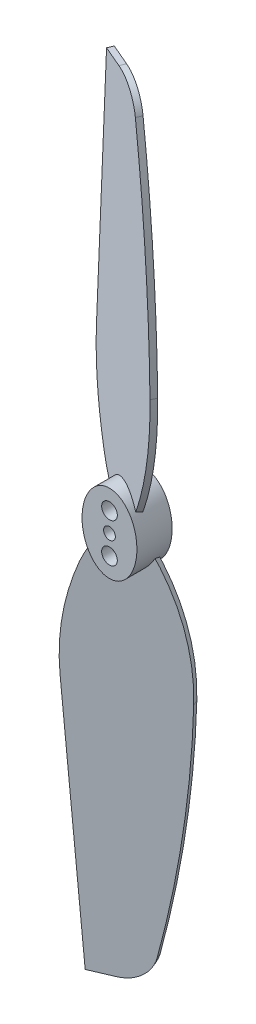
ISO-10303-21;
HEADER;
FILE_DESCRIPTION(('STEP AP214'),'2;1');
FILE_NAME('part.step','',(''),(''),'','','');
FILE_SCHEMA(('AUTOMOTIVE_DESIGN { 1 0 10303 214 1 1 1 1 }'));
ENDSEC;
DATA;
#1=APPLICATION_CONTEXT('core data for automotive mechanical design processes');
#2=APPLICATION_PROTOCOL_DEFINITION('international standard','automotive_design',2000,#1);
#3=PRODUCT_CONTEXT('',#1,'mechanical');
#4=PRODUCT('Part','Part','',(#3));
#5=PRODUCT_RELATED_PRODUCT_CATEGORY('part','',(#4));
#6=PRODUCT_DEFINITION_FORMATION('','',#4);
#7=PRODUCT_DEFINITION_CONTEXT('part definition',#1,'design');
#8=PRODUCT_DEFINITION('design','',#6,#7);
#9=PRODUCT_DEFINITION_SHAPE('','',#8);
#10=(LENGTH_UNIT() NAMED_UNIT(*) SI_UNIT(.MILLI.,.METRE.));
#11=(NAMED_UNIT(*) PLANE_ANGLE_UNIT() SI_UNIT($,.RADIAN.));
#12=(NAMED_UNIT(*) SI_UNIT($,.STERADIAN.) SOLID_ANGLE_UNIT());
#13=UNCERTAINTY_MEASURE_WITH_UNIT(LENGTH_MEASURE(1.E-05),#10,'distance_accuracy_value','');
#14=(GEOMETRIC_REPRESENTATION_CONTEXT(3) GLOBAL_UNCERTAINTY_ASSIGNED_CONTEXT((#13)) GLOBAL_UNIT_ASSIGNED_CONTEXT((#10,
#11,#12)) REPRESENTATION_CONTEXT('',''));
#15=CARTESIAN_POINT('',(0.,0.,0.));
#16=DIRECTION('',(0.,0.,1.));
#17=DIRECTION('',(1.,0.,0.));
#18=AXIS2_PLACEMENT_3D('',#15,#16,#17);
#19=CARTESIAN_POINT('',(0.,0.,4.5));
#20=DIRECTION('',(0.,0.,1.));
#21=DIRECTION('',(0.,1.,0.));
#22=AXIS2_PLACEMENT_3D('',#19,#20,#21);
#23=ELLIPSE('',#22,5.,3.5);
#24=DIRECTION('',(0.,0.,-1.));
#25=VECTOR('',#24,1.);
#26=SURFACE_OF_LINEAR_EXTRUSION('',#23,#25);
#27=CARTESIAN_POINT('',(0.,0.,0.));
#28=DIRECTION('',(0.,0.,1.));
#29=DIRECTION('',(0.,1.,0.));
#30=AXIS2_PLACEMENT_3D('',#27,#28,#29);
#31=ELLIPSE('',#30,5.,3.5);
#32=CARTESIAN_POINT('',(0.,5.,0.));
#33=VERTEX_POINT('',#32);
#34=EDGE_CURVE('E62',#33,#33,#31,.T.);
#35=ORIENTED_EDGE('',*,*,#34,.T.);
#36=EDGE_LOOP('',(#35));
#37=FACE_BOUND('',#36,.T.);
#38=CARTESIAN_POINT('',(0.,5.,4.5));
#39=VERTEX_POINT('',#38);
#40=EDGE_CURVE('E11',#39,#39,#23,.T.);
#41=ORIENTED_EDGE('',*,*,#40,.F.);
#42=EDGE_LOOP('',(#41));
#43=FACE_BOUND('',#42,.T.);
#44=ADVANCED_FACE('F54',(#37,#43),#26,.F.);
#45=CARTESIAN_POINT('',(0.,0.,4.5));
#46=DIRECTION('',(0.,0.,1.));
#47=DIRECTION('',(1.,0.,0.));
#48=AXIS2_PLACEMENT_3D('',#45,#46,#47);
#49=PLANE('',#48);
#50=CARTESIAN_POINT('',(0.,0.,4.5));
#51=DIRECTION('',(0.,0.,1.));
#52=DIRECTION('',(1.,0.,0.));
#53=AXIS2_PLACEMENT_3D('',#50,#51,#52);
#54=CIRCLE('',#53,0.75);
#55=CARTESIAN_POINT('',(0.75,0.,4.5));
#56=VERTEX_POINT('',#55);
#57=EDGE_CURVE('E75',#56,#56,#54,.T.);
#58=ORIENTED_EDGE('',*,*,#57,.F.);
#59=EDGE_LOOP('',(#58));
#60=FACE_BOUND('',#59,.T.);
#61=CARTESIAN_POINT('',(0.,2.5,4.5));
#62=DIRECTION('',(0.,0.,1.));
#63=DIRECTION('',(1.,0.,0.));
#64=AXIS2_PLACEMENT_3D('',#61,#62,#63);
#65=CIRCLE('',#64,1.);
#66=CARTESIAN_POINT('',(1.,2.5,4.5));
#67=VERTEX_POINT('',#66);
#68=EDGE_CURVE('E121',#67,#67,#65,.T.);
#69=ORIENTED_EDGE('',*,*,#68,.F.);
#70=EDGE_LOOP('',(#69));
#71=FACE_BOUND('',#70,.T.);
#72=CARTESIAN_POINT('',(0.,-2.5,4.5));
#73=DIRECTION('',(0.,0.,1.));
#74=DIRECTION('',(1.,0.,0.));
#75=AXIS2_PLACEMENT_3D('',#72,#73,#74);
#76=CIRCLE('',#75,1.);
#77=CARTESIAN_POINT('',(1.,-2.5,4.5));
#78=VERTEX_POINT('',#77);
#79=EDGE_CURVE('E69',#78,#78,#76,.T.);
#80=ORIENTED_EDGE('',*,*,#79,.F.);
#81=EDGE_LOOP('',(#80));
#82=FACE_BOUND('',#81,.T.);
#83=ORIENTED_EDGE('',*,*,#40,.T.);
#84=EDGE_LOOP('',(#83));
#85=FACE_BOUND('',#84,.T.);
#86=ADVANCED_FACE('F97',(#60,#71,#82,#85),#49,.T.);
#87=CARTESIAN_POINT('',(0.,0.,0.));
#88=DIRECTION('',(0.,0.,1.));
#89=DIRECTION('',(1.,0.,0.));
#90=AXIS2_PLACEMENT_3D('',#87,#88,#89);
#91=PLANE('',#90);
#92=CARTESIAN_POINT('',(0.,0.,0.));
#93=DIRECTION('',(0.,0.,1.));
#94=DIRECTION('',(1.,0.,0.));
#95=AXIS2_PLACEMENT_3D('',#92,#93,#94);
#96=CIRCLE('',#95,0.75);
#97=CARTESIAN_POINT('',(0.75,0.,0.));
#98=VERTEX_POINT('',#97);
#99=EDGE_CURVE('E58',#98,#98,#96,.T.);
#100=ORIENTED_EDGE('',*,*,#99,.T.);
#101=EDGE_LOOP('',(#100));
#102=FACE_BOUND('',#101,.T.);
#103=CARTESIAN_POINT('',(0.,2.5,0.));
#104=DIRECTION('',(0.,0.,1.));
#105=DIRECTION('',(1.,0.,0.));
#106=AXIS2_PLACEMENT_3D('',#103,#104,#105);
#107=CIRCLE('',#106,1.);
#108=CARTESIAN_POINT('',(1.,2.5,0.));
#109=VERTEX_POINT('',#108);
#110=EDGE_CURVE('E74',#109,#109,#107,.T.);
#111=ORIENTED_EDGE('',*,*,#110,.T.);
#112=EDGE_LOOP('',(#111));
#113=FACE_BOUND('',#112,.T.);
#114=CARTESIAN_POINT('',(0.,-2.5,0.));
#115=DIRECTION('',(0.,0.,1.));
#116=DIRECTION('',(1.,0.,0.));
#117=AXIS2_PLACEMENT_3D('',#114,#115,#116);
#118=CIRCLE('',#117,1.);
#119=CARTESIAN_POINT('',(1.,-2.5,0.));
#120=VERTEX_POINT('',#119);
#121=EDGE_CURVE('E72',#120,#120,#118,.T.);
#122=ORIENTED_EDGE('',*,*,#121,.T.);
#123=EDGE_LOOP('',(#122));
#124=FACE_BOUND('',#123,.T.);
#125=ORIENTED_EDGE('',*,*,#34,.F.);
#126=EDGE_LOOP('',(#125));
#127=FACE_BOUND('',#126,.T.);
#128=ADVANCED_FACE('F82',(#102,#113,#124,#127),#91,.F.);
#129=CARTESIAN_POINT('',(0.,-2.5,-0.689462870256029));
#130=DIRECTION('',(0.,0.,1.));
#131=DIRECTION('',(1.,0.,0.));
#132=AXIS2_PLACEMENT_3D('',#129,#130,#131);
#133=CYLINDRICAL_SURFACE('',#132,1.);
#134=ORIENTED_EDGE('',*,*,#79,.T.);
#135=EDGE_LOOP('',(#134));
#136=FACE_BOUND('',#135,.T.);
#137=ORIENTED_EDGE('',*,*,#121,.F.);
#138=EDGE_LOOP('',(#137));
#139=FACE_BOUND('',#138,.T.);
#140=ADVANCED_FACE('F92',(#136,#139),#133,.F.);
#141=CARTESIAN_POINT('',(0.,2.5,-0.689462870256029));
#142=DIRECTION('',(0.,0.,1.));
#143=DIRECTION('',(1.,0.,0.));
#144=AXIS2_PLACEMENT_3D('',#141,#142,#143);
#145=CYLINDRICAL_SURFACE('',#144,1.);
#146=ORIENTED_EDGE('',*,*,#68,.T.);
#147=EDGE_LOOP('',(#146));
#148=FACE_BOUND('',#147,.T.);
#149=ORIENTED_EDGE('',*,*,#110,.F.);
#150=EDGE_LOOP('',(#149));
#151=FACE_BOUND('',#150,.T.);
#152=ADVANCED_FACE('F86',(#148,#151),#145,.F.);
#153=CARTESIAN_POINT('',(0.,0.,-0.689462870256029));
#154=DIRECTION('',(0.,0.,1.));
#155=DIRECTION('',(1.,0.,0.));
#156=AXIS2_PLACEMENT_3D('',#153,#154,#155);
#157=CYLINDRICAL_SURFACE('',#156,0.75);
#158=ORIENTED_EDGE('',*,*,#57,.T.);
#159=EDGE_LOOP('',(#158));
#160=FACE_BOUND('',#159,.T.);
#161=ORIENTED_EDGE('',*,*,#99,.F.);
#162=EDGE_LOOP('',(#161));
#163=FACE_BOUND('',#162,.T.);
#164=ADVANCED_FACE('F84',(#160,#163),#157,.F.);
#165=CLOSED_SHELL('',(#44,#86,#128,#140,#152,#164));
#166=MANIFOLD_SOLID_BREP('B2',#165);
#167=CARTESIAN_POINT('',(1.3145287411941,0.,2.27814653766199));
#168=DIRECTION('',(0.,1.,0.));
#169=DIRECTION('',(-0.724137930705924,0.,-0.68965517275878));
#170=AXIS2_PLACEMENT_3D('',#167,#168,#169);
#171=PLANE('',#170);
#172=DIRECTION('',(0.,0.,1.));
#173=VECTOR('',#172,1.);
#174=CARTESIAN_POINT('',(-0.75,0.,-0.689462870256029));
#175=LINE('',#174,#173);
#176=CARTESIAN_POINT('',(-0.749999999999999,0.,2.34696887869071));
#177=VERTEX_POINT('',#176);
#178=CARTESIAN_POINT('',(-0.75,0.,2.53809487809043));
#179=VERTEX_POINT('',#178);
#180=EDGE_CURVE('E327',#177,#179,#175,.T.);
#181=ORIENTED_EDGE('',*,*,#180,.F.);
#182=DIRECTION('',(-0.919145030205725,0.,0.393919298141278));
#183=VECTOR('',#182,1.);
#184=CARTESIAN_POINT('',(1.01908926758814,0.,1.5887877650077));
#185=LINE('',#184,#183);
#186=CARTESIAN_POINT('',(-0.819200792823308,0.,2.37662636129025));
#187=VERTEX_POINT('',#186);
#188=EDGE_CURVE('E301',#177,#187,#185,.T.);
#189=ORIENTED_EDGE('',*,*,#188,.T.);
#190=DIRECTION('',(-0.393919298141278,0.,-0.919145030205725));
#191=VECTOR('',#190,1.);
#192=CARTESIAN_POINT('',(-0.52376131921735,0.,3.06598513394455));
#193=LINE('',#192,#191);
#194=EDGE_CURVE('E308',#179,#187,#193,.T.);
#195=ORIENTED_EDGE('',*,*,#194,.F.);
#196=EDGE_LOOP('',(#181,#189,#195));
#197=FACE_BOUND('',#196,.T.);
#198=ADVANCED_FACE('F177',(#197),#171,.T.);
#199=CARTESIAN_POINT('',(21.9152398199257,-15.7156926478818,-6.55072962732023));
#200=DIRECTION('',(-0.393919298141278,0.,-0.919145030205725));
#201=DIRECTION('',(-0.919145030205725,0.,0.393919298141278));
#202=AXIS2_PLACEMENT_3D('',#199,#200,#201);
#203=CYLINDRICAL_SURFACE('',#202,30.);
#204=CARTESIAN_POINT('',(21.6198003463197,-15.7156926478818,-7.24008839997453));
#205=DIRECTION('',(0.393919298141278,0.,0.919145030205725));
#206=DIRECTION('',(-0.919145030205725,0.,0.393919298141278));
#207=AXIS2_PLACEMENT_3D('',#204,#205,#206);
#208=CIRCLE('',#207,30.);
#209=CARTESIAN_POINT('',(-4.13552137977223,-5.,3.79790661096967));
#210=VERTEX_POINT('',#209);
#211=CARTESIAN_POINT('',(-5.8744984589548,-18.,4.54318250106728));
#212=VERTEX_POINT('',#211);
#213=EDGE_CURVE('E287',#210,#212,#208,.T.);
#214=ORIENTED_EDGE('',*,*,#213,.T.);
#215=DIRECTION('',(-0.393919298141278,0.,-0.919145030205725));
#216=VECTOR('',#215,1.);
#217=CARTESIAN_POINT('',(-5.57905898534884,-18.,5.23254127372158));
#218=LINE('',#217,#216);
#219=CARTESIAN_POINT('',(-5.57905898534884,-18.,5.23254127372158));
#220=VERTEX_POINT('',#219);
#221=EDGE_CURVE('E286',#220,#212,#218,.T.);
#222=ORIENTED_EDGE('',*,*,#221,.F.);
#223=CARTESIAN_POINT('',(21.9152398199257,-15.7156926478818,-6.55072962732023));
#224=DIRECTION('',(0.393919298141278,0.,0.919145030205725));
#225=DIRECTION('',(-0.919145030205725,0.,0.393919298141278));
#226=AXIS2_PLACEMENT_3D('',#223,#224,#225);
#227=CIRCLE('',#226,30.);
#228=CARTESIAN_POINT('',(-3.84008190616627,-5.,4.48726538362396));
#229=VERTEX_POINT('',#228);
#230=EDGE_CURVE('E306',#229,#220,#227,.T.);
#231=ORIENTED_EDGE('',*,*,#230,.F.);
#232=DIRECTION('',(-0.393919298141278,0.,-0.919145030205725));
#233=VECTOR('',#232,1.);
#234=CARTESIAN_POINT('',(-3.84008190616627,-5.,4.48726538362396));
#235=LINE('',#234,#233);
#236=EDGE_CURVE('E185',#229,#210,#235,.T.);
#237=ORIENTED_EDGE('',*,*,#236,.T.);
#238=EDGE_LOOP('',(#214,#222,#231,#237));
#239=FACE_BOUND('',#238,.T.);
#240=ADVANCED_FACE('F179',(#239),#203,.T.);
#241=CARTESIAN_POINT('',(6.46204678427051,-9.28627705915271,0.0720673792462853));
#242=DIRECTION('',(-0.393919298141278,0.,-0.919145030205725));
#243=DIRECTION('',(-0.919145030205725,0.,0.393919298141278));
#244=AXIS2_PLACEMENT_3D('',#241,#242,#243);
#245=CYLINDRICAL_SURFACE('',#244,12.);
#246=CARTESIAN_POINT('',(-0.75,0.,2.53809487809043));
#247=CARTESIAN_POINT('',(-0.749996468598497,-0.0164378048235438,2.58908687690633));
#248=CARTESIAN_POINT('',(-0.749459645822779,-0.0326092065875987,2.64016267214185));
#249=CARTESIAN_POINT('',(-0.747397567067205,-0.0644396910591233,2.74243276950829));
#250=CARTESIAN_POINT('',(-0.745872686743596,-0.0800989660995931,2.79362701923538));
#251=CARTESIAN_POINT('',(-0.741912546858403,-0.110937937879825,2.89612307861109));
#252=CARTESIAN_POINT('',(-0.739477298974362,-0.126117640768485,2.94742488687164));
#253=CARTESIAN_POINT('',(-0.733750101990573,-0.15601889722111,3.05013551591533));
#254=CARTESIAN_POINT('',(-0.730457827728856,-0.170740274514427,3.10154436995264));
#255=CARTESIAN_POINT('',(-0.726764836807171,-0.185237339596115,3.15298664136786));
#256=B_SPLINE_CURVE_WITH_KNOTS('',3,(#246,#247,#248,#249,#250,#251,#252,#253,#254,#255),
.UNSPECIFIED.,.F.,.F.,(4,2,2,2,4),(0.,0.160721728299978,0.321382386550923,0.482040984032935,
0.642760625609639),.UNSPECIFIED.);
#257=CARTESIAN_POINT('',(-0.726764836806105,-0.185237339595355,3.15298664136811));
#258=VERTEX_POINT('',#257);
#259=EDGE_CURVE('E332',#179,#258,#256,.T.);
#260=ORIENTED_EDGE('',*,*,#259,.F.);
#261=ORIENTED_EDGE('',*,*,#194,.T.);
#262=CARTESIAN_POINT('',(6.16660731066455,-9.28627705915271,-0.61729139340801));
#263=DIRECTION('',(0.393919298141278,0.,0.919145030205725));
#264=DIRECTION('',(-0.919145030205725,0.,0.393919298141278));
#265=AXIS2_PLACEMENT_3D('',#262,#263,#264);
#266=CIRCLE('',#265,12.);
#267=EDGE_CURVE('E233',#187,#210,#266,.T.);
#268=ORIENTED_EDGE('',*,*,#267,.T.);
#269=ORIENTED_EDGE('',*,*,#236,.F.);
#270=CARTESIAN_POINT('',(6.46204678427051,-9.28627705915271,0.0720673792462853));
#271=DIRECTION('',(0.393919298141278,0.,0.919145030205725));
#272=DIRECTION('',(-0.919145030205725,0.,0.393919298141278));
#273=AXIS2_PLACEMENT_3D('',#270,#271,#272);
#274=CIRCLE('',#273,12.);
#275=EDGE_CURVE('E200',#258,#229,#274,.T.);
#276=ORIENTED_EDGE('',*,*,#275,.F.);
#277=EDGE_LOOP('',(#260,#261,#268,#269,#276));
#278=FACE_BOUND('',#277,.T.);
#279=ADVANCED_FACE('F342',(#278),#245,.T.);
#280=DIRECTION('',(0.,0.,1.));
#281=VECTOR('',#280,1.);
#282=CARTESIAN_POINT('',(0.75,0.,-0.689462870256029));
#283=LINE('',#282,#281);
#284=CARTESIAN_POINT('',(0.75,0.,2.52008742642683));
#285=VERTEX_POINT('',#284);
#286=CARTESIAN_POINT('',(0.750000000000001,0.,1.70411173667944));
#287=VERTEX_POINT('',#286);
#288=EDGE_CURVE('E191',#285,#287,#283,.F.);
#289=ORIENTED_EDGE('',*,*,#288,.F.);
#290=DIRECTION('',(-0.919145030205725,0.,0.393919298141278));
#291=VECTOR('',#290,1.);
#292=CARTESIAN_POINT('',(1.3145287411941,0.,2.27814653766199));
#293=LINE('',#292,#291);
#294=CARTESIAN_POINT('',(1.31452874119409,0.,2.278146537662));
#295=VERTEX_POINT('',#294);
#296=EDGE_CURVE('E280',#295,#285,#293,.T.);
#297=ORIENTED_EDGE('',*,*,#296,.F.);
#298=DIRECTION('',(-0.393919298141278,0.,-0.919145030205725));
#299=VECTOR('',#298,1.);
#300=CARTESIAN_POINT('',(1.31452874119409,0.,2.278146537662));
#301=LINE('',#300,#299);
#302=CARTESIAN_POINT('',(1.01908926758813,0.,1.5887877650077));
#303=VERTEX_POINT('',#302);
#304=EDGE_CURVE('E274',#295,#303,#301,.T.);
#305=ORIENTED_EDGE('',*,*,#304,.T.);
#306=EDGE_CURVE('E302',#303,#287,#185,.T.);
#307=ORIENTED_EDGE('',*,*,#306,.T.);
#308=EDGE_LOOP('',(#289,#297,#305,#307));
#309=FACE_BOUND('',#308,.T.);
#310=ADVANCED_FACE('F363',(#309),#171,.T.);
#311=CARTESIAN_POINT('',(-21.197524437125,-17.3240618265888,11.9261693156753));
#312=DIRECTION('',(-0.393919298141278,0.,-0.919145030205725));
#313=DIRECTION('',(-0.919145030205725,0.,0.393919298141278));
#314=AXIS2_PLACEMENT_3D('',#311,#312,#313);
#315=CYLINDRICAL_SURFACE('',#314,30.);
#316=CARTESIAN_POINT('',(-21.4929639107309,-17.3240618265888,11.236810543021));
#317=DIRECTION('',(-0.393919298141278,0.,-0.919145030205725));
#318=DIRECTION('',(0.919145030205725,0.,-0.393919298141278));
#319=AXIS2_PLACEMENT_3D('',#316,#317,#318);
#320=CIRCLE('',#319,30.);
#321=CARTESIAN_POINT('',(6.07438693371967,-18.,-0.577768374769338));
#322=VERTEX_POINT('',#321);
#323=EDGE_CURVE('E299',#303,#322,#320,.T.);
#324=ORIENTED_EDGE('',*,*,#323,.F.);
#325=ORIENTED_EDGE('',*,*,#304,.F.);
#326=CARTESIAN_POINT('',(-21.197524437125,-17.3240618265888,11.9261693156753));
#327=DIRECTION('',(-0.393919298141278,0.,-0.919145030205725));
#328=DIRECTION('',(0.919145030205725,0.,-0.393919298141278));
#329=AXIS2_PLACEMENT_3D('',#326,#327,#328);
#330=CIRCLE('',#329,30.);
#331=CARTESIAN_POINT('',(6.36982640732562,-18.,0.111590397884956));
#332=VERTEX_POINT('',#331);
#333=EDGE_CURVE('E259',#295,#332,#330,.T.);
#334=ORIENTED_EDGE('',*,*,#333,.T.);
#335=DIRECTION('',(-0.393919298141278,0.,-0.919145030205725));
#336=VECTOR('',#335,1.);
#337=CARTESIAN_POINT('',(6.36982640732562,-18.,0.111590397884956));
#338=LINE('',#337,#336);
#339=EDGE_CURVE('E268',#332,#322,#338,.T.);
#340=ORIENTED_EDGE('',*,*,#339,.T.);
#341=EDGE_LOOP('',(#324,#325,#334,#340));
#342=FACE_BOUND('',#341,.T.);
#343=ADVANCED_FACE('F277',(#342),#315,.T.);
#344=CARTESIAN_POINT('',(-127.576836429602,-14.715692301252,57.5173029667481));
#345=DIRECTION('',(-0.393919298141278,0.,-0.919145030205725));
#346=DIRECTION('',(-0.919145030205725,0.,0.393919298141278));
#347=AXIS2_PLACEMENT_3D('',#344,#345,#346);
#348=CYLINDRICAL_SURFACE('',#347,145.766631976418);
#349=CARTESIAN_POINT('',(-127.872275903208,-14.715692301252,56.8279441940938));
#350=DIRECTION('',(-0.393919298141278,0.,-0.919145030205725));
#351=DIRECTION('',(0.919145030205725,0.,-0.393919298141278));
#352=AXIS2_PLACEMENT_3D('',#349,#350,#351);
#353=CIRCLE('',#352,145.766631976418);
#354=CARTESIAN_POINT('',(2.80562123359325,-46.8818098813125,0.823131209155812));
#355=VERTEX_POINT('',#354);
#356=EDGE_CURVE('E271',#322,#355,#353,.T.);
#357=ORIENTED_EDGE('',*,*,#356,.F.);
#358=ORIENTED_EDGE('',*,*,#339,.F.);
#359=CARTESIAN_POINT('',(-127.576836429602,-14.715692301252,57.5173029667481));
#360=DIRECTION('',(-0.393919298141278,0.,-0.919145030205725));
#361=DIRECTION('',(0.919145030205725,0.,-0.393919298141278));
#362=AXIS2_PLACEMENT_3D('',#359,#360,#361);
#363=CIRCLE('',#362,145.766631976418);
#364=CARTESIAN_POINT('',(3.10106070719921,-46.8818098813125,1.51248998181011));
#365=VERTEX_POINT('',#364);
#366=EDGE_CURVE('E254',#332,#365,#363,.T.);
#367=ORIENTED_EDGE('',*,*,#366,.T.);
#368=DIRECTION('',(-0.393919298141278,0.,-0.919145030205725));
#369=VECTOR('',#368,1.);
#370=CARTESIAN_POINT('',(3.10106070719921,-46.8818098813125,1.51248998181011));
#371=LINE('',#370,#369);
#372=EDGE_CURVE('E275',#365,#355,#371,.T.);
#373=ORIENTED_EDGE('',*,*,#372,.T.);
#374=EDGE_LOOP('',(#357,#358,#367,#373));
#375=FACE_BOUND('',#374,.T.);
#376=ADVANCED_FACE('F269',(#375),#348,.T.);
#377=CARTESIAN_POINT('',(-0.487208620676712,-45.9985641631131,3.05031969173346));
#378=DIRECTION('',(-0.393919298141278,0.,-0.919145030205725));
#379=DIRECTION('',(-0.919145030205725,0.,0.393919298141278));
#380=AXIS2_PLACEMENT_3D('',#377,#378,#379);
#381=CYLINDRICAL_SURFACE('',#380,4.00258916013318);
#382=CARTESIAN_POINT('',(-0.78264809428267,-45.9985641631131,2.36096091907916));
#383=DIRECTION('',(0.393919298141278,0.,0.919145030205725));
#384=DIRECTION('',(-0.919145030205725,0.,0.393919298141278));
#385=AXIS2_PLACEMENT_3D('',#382,#383,#384);
#386=CIRCLE('',#385,4.00258916013318);
#387=CARTESIAN_POINT('',(-0.870958887229646,-50.,2.39880840172092));
#388=VERTEX_POINT('',#387);
#389=EDGE_CURVE('E296',#388,#355,#386,.T.);
#390=ORIENTED_EDGE('',*,*,#389,.T.);
#391=ORIENTED_EDGE('',*,*,#372,.F.);
#392=CARTESIAN_POINT('',(-0.487208620676712,-45.9985641631131,3.05031969173346));
#393=DIRECTION('',(0.393919298141278,0.,0.919145030205725));
#394=DIRECTION('',(-0.919145030205725,0.,0.393919298141278));
#395=AXIS2_PLACEMENT_3D('',#392,#393,#394);
#396=CIRCLE('',#395,4.00258916013318);
#397=CARTESIAN_POINT('',(-0.575519413623688,-50.,3.08816717437522));
#398=VERTEX_POINT('',#397);
#399=EDGE_CURVE('E262',#398,#365,#396,.T.);
#400=ORIENTED_EDGE('',*,*,#399,.F.);
#401=DIRECTION('',(-0.393919298141278,0.,-0.919145030205725));
#402=VECTOR('',#401,1.);
#403=CARTESIAN_POINT('',(-0.575519413623688,-50.,3.08816717437522));
#404=LINE('',#403,#402);
#405=EDGE_CURVE('E312',#398,#388,#404,.T.);
#406=ORIENTED_EDGE('',*,*,#405,.T.);
#407=EDGE_LOOP('',(#390,#391,#400,#406));
#408=FACE_BOUND('',#407,.T.);
#409=ADVANCED_FACE('F395',(#408),#381,.T.);
#410=CARTESIAN_POINT('',(-0.575519413623688,-50.,3.08816717437522));
#411=DIRECTION('',(0.,1.,0.));
#412=DIRECTION('',(-0.724137930705924,0.,-0.68965517275878));
#413=AXIS2_PLACEMENT_3D('',#410,#411,#412);
#414=PLANE('',#413);
#415=DIRECTION('',(-0.919145030205725,0.,0.393919298141278));
#416=VECTOR('',#415,1.);
#417=CARTESIAN_POINT('',(-0.870958887229646,-50.,2.39880840172092));
#418=LINE('',#417,#416);
#419=CARTESIAN_POINT('',(-3.62839397784682,-50.,3.58056629614476));
#420=VERTEX_POINT('',#419);
#421=EDGE_CURVE('E293',#388,#420,#418,.T.);
#422=ORIENTED_EDGE('',*,*,#421,.F.);
#423=ORIENTED_EDGE('',*,*,#405,.F.);
#424=DIRECTION('',(-0.919145030205725,0.,0.393919298141278));
#425=VECTOR('',#424,1.);
#426=CARTESIAN_POINT('',(-0.575519413623688,-50.,3.08816717437522));
#427=LINE('',#426,#425);
#428=CARTESIAN_POINT('',(-3.33295450424086,-50.,4.26992506879905));
#429=VERTEX_POINT('',#428);
#430=EDGE_CURVE('E386',#398,#429,#427,.T.);
#431=ORIENTED_EDGE('',*,*,#430,.T.);
#432=DIRECTION('',(-0.393919298141278,0.,-0.919145030205725));
#433=VECTOR('',#432,1.);
#434=CARTESIAN_POINT('',(-3.33295450424086,-50.,4.26992506879905));
#435=LINE('',#434,#433);
#436=EDGE_CURVE('E315',#429,#420,#435,.T.);
#437=ORIENTED_EDGE('',*,*,#436,.T.);
#438=EDGE_LOOP('',(#422,#423,#431,#437));
#439=FACE_BOUND('',#438,.T.);
#440=ADVANCED_FACE('F392',(#439),#414,.F.);
#441=CARTESIAN_POINT('',(-5.57905898534884,-18.,5.23254127372158));
#442=DIRECTION('',(-0.916476626842484,-0.0761435784039412,0.392775696701394));
#443=DIRECTION('',(0.393919298141278,0.,0.919145030205725));
#444=AXIS2_PLACEMENT_3D('',#441,#442,#443);
#445=PLANE('',#444);
#446=DIRECTION('',(0.0699869916720625,-0.99709686363354,-0.0299944249628459));
#447=VECTOR('',#446,1.);
#448=CARTESIAN_POINT('',(-5.8744984589548,-18.,4.54318250106728));
#449=LINE('',#448,#447);
#450=EDGE_CURVE('E290',#212,#420,#449,.T.);
#451=ORIENTED_EDGE('',*,*,#450,.T.);
#452=ORIENTED_EDGE('',*,*,#436,.F.);
#453=DIRECTION('',(0.0699869916720625,-0.99709686363354,-0.0299944249628459));
#454=VECTOR('',#453,1.);
#455=CARTESIAN_POINT('',(-5.57905898534884,-18.,5.23254127372158));
#456=LINE('',#455,#454);
#457=EDGE_CURVE('E242',#220,#429,#456,.T.);
#458=ORIENTED_EDGE('',*,*,#457,.F.);
#459=ORIENTED_EDGE('',*,*,#221,.T.);
#460=EDGE_LOOP('',(#451,#452,#458,#459));
#461=FACE_BOUND('',#460,.T.);
#462=ADVANCED_FACE('F355',(#461),#445,.T.);
#463=CARTESIAN_POINT('',(21.9152398199257,-15.7156926478818,-6.55072962732023));
#464=DIRECTION('',(-0.393919298141278,0.,-0.919145030205725));
#465=DIRECTION('',(-0.919145030205725,0.,0.393919298141278));
#466=AXIS2_PLACEMENT_3D('',#463,#464,#465);
#467=PLANE('',#466);
#468=CARTESIAN_POINT('',(0.,-2.5,2.84151599743247));
#469=DIRECTION('',(-0.393919298141278,0.,-0.919145030205725));
#470=DIRECTION('',(-0.919145030205725,0.,0.393919298141278));
#471=AXIS2_PLACEMENT_3D('',#468,#469,#470);
#472=ELLIPSE('',#471,1.08796758632985,1.);
#473=CARTESIAN_POINT('',(-1.,-2.5,3.27008742543998));
#474=VERTEX_POINT('',#473);
#475=EDGE_CURVE('E320',#474,#474,#472,.T.);
#476=ORIENTED_EDGE('',*,*,#475,.T.);
#477=EDGE_LOOP('',(#476));
#478=FACE_BOUND('',#477,.T.);
#479=ORIENTED_EDGE('',*,*,#296,.T.);
#480=CARTESIAN_POINT('',(0.,0.,2.84151599743247));
#481=DIRECTION('',(-0.393919298141278,0.,-0.919145030205725));
#482=DIRECTION('',(-0.919145030205725,0.,0.393919298141278));
#483=AXIS2_PLACEMENT_3D('',#480,#481,#482);
#484=ELLIPSE('',#483,0.815975689747388,0.75);
#485=EDGE_CURVE('E291',#285,#258,#484,.T.);
#486=ORIENTED_EDGE('',*,*,#485,.T.);
#487=ORIENTED_EDGE('',*,*,#275,.T.);
#488=ORIENTED_EDGE('',*,*,#230,.T.);
#489=ORIENTED_EDGE('',*,*,#457,.T.);
#490=ORIENTED_EDGE('',*,*,#430,.F.);
#491=ORIENTED_EDGE('',*,*,#399,.T.);
#492=ORIENTED_EDGE('',*,*,#366,.F.);
#493=ORIENTED_EDGE('',*,*,#333,.F.);
#494=EDGE_LOOP('',(#479,#486,#487,#488,#489,#490,#491,#492,#493));
#495=FACE_BOUND('',#494,.T.);
#496=ADVANCED_FACE('F257',(#478,#495),#467,.F.);
#497=CARTESIAN_POINT('',(21.6198003463197,-15.7156926478818,-7.24008839997453));
#498=DIRECTION('',(-0.393919298141278,0.,-0.919145030205725));
#499=DIRECTION('',(-0.919145030205725,0.,0.393919298141278));
#500=AXIS2_PLACEMENT_3D('',#497,#498,#499);
#501=PLANE('',#500);
#502=CARTESIAN_POINT('',(0.,0.,2.02554030768508));
#503=DIRECTION('',(-0.393919298141278,0.,-0.919145030205725));
#504=DIRECTION('',(-0.919145030205725,0.,0.393919298141278));
#505=AXIS2_PLACEMENT_3D('',#502,#503,#504);
#506=ELLIPSE('',#505,0.815975689747388,0.75);
#507=EDGE_CURVE('E52',#287,#177,#506,.T.);
#508=ORIENTED_EDGE('',*,*,#507,.F.);
#509=ORIENTED_EDGE('',*,*,#306,.F.);
#510=ORIENTED_EDGE('',*,*,#323,.T.);
#511=ORIENTED_EDGE('',*,*,#356,.T.);
#512=ORIENTED_EDGE('',*,*,#389,.F.);
#513=ORIENTED_EDGE('',*,*,#421,.T.);
#514=ORIENTED_EDGE('',*,*,#450,.F.);
#515=ORIENTED_EDGE('',*,*,#213,.F.);
#516=ORIENTED_EDGE('',*,*,#267,.F.);
#517=ORIENTED_EDGE('',*,*,#188,.F.);
#518=EDGE_LOOP('',(#508,#509,#510,#511,#512,#513,#514,#515,#516,#517));
#519=FACE_BOUND('',#518,.T.);
#520=CARTESIAN_POINT('',(0.,-2.5,2.02554030768508));
#521=DIRECTION('',(-0.393919298141278,0.,-0.919145030205725));
#522=DIRECTION('',(-0.919145030205725,0.,0.393919298141278));
#523=AXIS2_PLACEMENT_3D('',#520,#521,#522);
#524=ELLIPSE('',#523,1.08796758632985,1.);
#525=CARTESIAN_POINT('',(-1.,-2.5,2.45411173569259));
#526=VERTEX_POINT('',#525);
#527=EDGE_CURVE('E318',#526,#526,#524,.T.);
#528=ORIENTED_EDGE('',*,*,#527,.F.);
#529=EDGE_LOOP('',(#528));
#530=FACE_BOUND('',#529,.T.);
#531=ADVANCED_FACE('F353',(#519,#530),#501,.T.);
#532=CARTESIAN_POINT('',(0.,-2.5,-0.689462870256029));
#533=DIRECTION('',(0.,0.,1.));
#534=DIRECTION('',(1.,0.,0.));
#535=AXIS2_PLACEMENT_3D('',#532,#533,#534);
#536=CYLINDRICAL_SURFACE('',#535,1.);
#537=ORIENTED_EDGE('',*,*,#527,.T.);
#538=EDGE_LOOP('',(#537));
#539=FACE_BOUND('',#538,.T.);
#540=ORIENTED_EDGE('',*,*,#475,.F.);
#541=EDGE_LOOP('',(#540));
#542=FACE_BOUND('',#541,.T.);
#543=ADVANCED_FACE('F350',(#539,#542),#536,.F.);
#544=CARTESIAN_POINT('',(0.,0.,-0.689462870256029));
#545=DIRECTION('',(0.,0.,1.));
#546=DIRECTION('',(1.,0.,0.));
#547=AXIS2_PLACEMENT_3D('',#544,#545,#546);
#548=CYLINDRICAL_SURFACE('',#547,0.75);
#549=ORIENTED_EDGE('',*,*,#288,.T.);
#550=ORIENTED_EDGE('',*,*,#507,.T.);
#551=ORIENTED_EDGE('',*,*,#180,.T.);
#552=ORIENTED_EDGE('',*,*,#259,.T.);
#553=ORIENTED_EDGE('',*,*,#485,.F.);
#554=EDGE_LOOP('',(#549,#550,#551,#552,#553));
#555=FACE_BOUND('',#554,.T.);
#556=ADVANCED_FACE('F346',(#555),#548,.F.);
#557=CLOSED_SHELL('',(#198,#240,#279,#310,#343,#376,#409,#440,#462,#496,#531,#543,#556));
#558=MANIFOLD_SOLID_BREP('B6',#557);
#559=CARTESIAN_POINT('',(0.771425293050869,0.,2.98859868483594));
#560=DIRECTION('',(0.,-1.,0.));
#561=DIRECTION('',(0.,0.,-1.));
#562=AXIS2_PLACEMENT_3D('',#559,#560,#561);
#563=PLANE('',#562);
#564=DIRECTION('',(0.,0.,1.));
#565=VECTOR('',#564,1.);
#566=CARTESIAN_POINT('',(0.75,0.,-0.689462870256029));
#567=LINE('',#566,#565);
#568=CARTESIAN_POINT('',(0.75,0.,2.16344072647158));
#569=VERTEX_POINT('',#568);
#570=CARTESIAN_POINT('',(0.75,0.,2.97941641638557));
#571=VERTEX_POINT('',#570);
#572=EDGE_CURVE('E698',#569,#571,#567,.T.);
#573=ORIENTED_EDGE('',*,*,#572,.F.);
#574=DIRECTION('',(-0.919145030018058,0.,-0.393919298579168));
#575=VECTOR('',#574,1.);
#576=CARTESIAN_POINT('',(1.06686476698524,0.,2.2992399123224));
#577=LINE('',#576,#575);
#578=CARTESIAN_POINT('',(1.06686476698523,0.,2.29923991232239));
#579=VERTEX_POINT('',#578);
#580=EDGE_CURVE('E632',#579,#569,#577,.T.);
#581=ORIENTED_EDGE('',*,*,#580,.F.);
#582=DIRECTION('',(0.393919298579168,0.,-0.919145030018058));
#583=VECTOR('',#582,1.);
#584=CARTESIAN_POINT('',(0.771425293050859,0.,2.98859868483594));
#585=LINE('',#584,#583);
#586=CARTESIAN_POINT('',(0.771425293050859,0.,2.98859868483594));
#587=VERTEX_POINT('',#586);
#588=EDGE_CURVE('E626',#587,#579,#585,.T.);
#589=ORIENTED_EDGE('',*,*,#588,.F.);
#590=DIRECTION('',(-0.919145030018058,0.,-0.393919298579168));
#591=VECTOR('',#590,1.);
#592=CARTESIAN_POINT('',(0.771425293050869,0.,2.98859868483594));
#593=LINE('',#592,#591);
#594=EDGE_CURVE('E630',#587,#571,#593,.T.);
#595=ORIENTED_EDGE('',*,*,#594,.T.);
#596=EDGE_LOOP('',(#573,#581,#589,#595));
#597=FACE_BOUND('',#596,.T.);
#598=ADVANCED_FACE('F546',(#597),#563,.T.);
#599=CARTESIAN_POINT('',(21.3721363675763,15.7156926478818,11.8174748596325));
#600=DIRECTION('',(0.393919298579168,0.,-0.919145030018058));
#601=DIRECTION('',(-0.919145030018058,0.,-0.393919298579168));
#602=AXIS2_PLACEMENT_3D('',#599,#600,#601);
#603=CYLINDRICAL_SURFACE('',#602,30.);
#604=CARTESIAN_POINT('',(21.6675758415107,15.7156926478818,11.128116087119));
#605=DIRECTION('',(0.393919298579168,0.,-0.919145030018058));
#606=DIRECTION('',(-0.919145030018058,0.,-0.393919298579168));
#607=AXIS2_PLACEMENT_3D('',#604,#605,#606);
#608=CIRCLE('',#607,30.);
#609=CARTESIAN_POINT('',(-4.08774587932268,5.,0.090121063904717));
#610=VERTEX_POINT('',#609);
#611=CARTESIAN_POINT('',(-5.82672295815019,18.,-0.65515482702136));
#612=VERTEX_POINT('',#611);
#613=EDGE_CURVE('E656',#610,#612,#608,.T.);
#614=ORIENTED_EDGE('',*,*,#613,.F.);
#615=DIRECTION('',(0.393919298579168,0.,-0.919145030018058));
#616=VECTOR('',#615,1.);
#617=CARTESIAN_POINT('',(-4.38318535325705,5.,0.779479836418261));
#618=LINE('',#617,#616);
#619=CARTESIAN_POINT('',(-4.38318535325705,5.,0.779479836418261));
#620=VERTEX_POINT('',#619);
#621=EDGE_CURVE('E554',#620,#610,#618,.T.);
#622=ORIENTED_EDGE('',*,*,#621,.F.);
#623=CARTESIAN_POINT('',(21.3721363675763,15.7156926478818,11.8174748596325));
#624=DIRECTION('',(0.393919298579168,0.,-0.919145030018058));
#625=DIRECTION('',(-0.919145030018058,0.,-0.393919298579168));
#626=AXIS2_PLACEMENT_3D('',#623,#624,#625);
#627=CIRCLE('',#626,30.);
#628=CARTESIAN_POINT('',(-6.12216243208456,18.,0.0342039454921836));
#629=VERTEX_POINT('',#628);
#630=EDGE_CURVE('E678',#620,#629,#627,.T.);
#631=ORIENTED_EDGE('',*,*,#630,.T.);
#632=DIRECTION('',(0.393919298579168,0.,-0.919145030018058));
#633=VECTOR('',#632,1.);
#634=CARTESIAN_POINT('',(-6.12216243208456,18.,0.0342039454921836));
#635=LINE('',#634,#633);
#636=EDGE_CURVE('E607',#629,#612,#635,.T.);
#637=ORIENTED_EDGE('',*,*,#636,.T.);
#638=EDGE_LOOP('',(#614,#622,#631,#637));
#639=FACE_BOUND('',#638,.T.);
#640=ADVANCED_FACE('F548',(#639),#603,.T.);
#641=CARTESIAN_POINT('',(5.91894333507628,9.28627705915271,5.19467784570398));
#642=DIRECTION('',(0.393919298579168,0.,-0.919145030018058));
#643=DIRECTION('',(-0.919145030018058,0.,-0.393919298579168));
#644=AXIS2_PLACEMENT_3D('',#641,#642,#643);
#645=CYLINDRICAL_SURFACE('',#644,12.);
#646=CARTESIAN_POINT('',(6.21438280901066,9.28627705915271,4.50531907319043));
#647=DIRECTION('',(0.393919298579168,0.,-0.919145030018058));
#648=DIRECTION('',(-0.919145030018058,0.,-0.393919298579168));
#649=AXIS2_PLACEMENT_3D('',#646,#647,#648);
#650=CIRCLE('',#649,12.);
#651=CARTESIAN_POINT('',(-0.771425293050871,0.,1.51140131516406));
#652=VERTEX_POINT('',#651);
#653=EDGE_CURVE('E675',#652,#610,#650,.T.);
#654=ORIENTED_EDGE('',*,*,#653,.F.);
#655=DIRECTION('',(0.393919298579168,0.,-0.919145030018058));
#656=VECTOR('',#655,1.);
#657=CARTESIAN_POINT('',(-1.06686476698525,0.,2.20076008767761));
#658=LINE('',#657,#656);
#659=CARTESIAN_POINT('',(-1.06686476698525,0.,2.20076008767761));
#660=VERTEX_POINT('',#659);
#661=EDGE_CURVE('E635',#660,#652,#658,.T.);
#662=ORIENTED_EDGE('',*,*,#661,.F.);
#663=CARTESIAN_POINT('',(5.91894333507628,9.28627705915271,5.19467784570398));
#664=DIRECTION('',(0.393919298579168,0.,-0.919145030018058));
#665=DIRECTION('',(-0.919145030018058,0.,-0.393919298579168));
#666=AXIS2_PLACEMENT_3D('',#663,#664,#665);
#667=CIRCLE('',#666,12.);
#668=EDGE_CURVE('E651',#660,#620,#667,.T.);
#669=ORIENTED_EDGE('',*,*,#668,.T.);
#670=ORIENTED_EDGE('',*,*,#621,.T.);
#671=EDGE_LOOP('',(#654,#662,#669,#670));
#672=FACE_BOUND('',#671,.T.);
#673=ADVANCED_FACE('F731',(#672),#645,.T.);
#674=DIRECTION('',(0.,0.,1.));
#675=VECTOR('',#674,1.);
#676=CARTESIAN_POINT('',(-0.75,0.,-0.689462870256029));
#677=LINE('',#676,#675);
#678=CARTESIAN_POINT('',(-0.75,0.,2.33655927352843));
#679=VERTEX_POINT('',#678);
#680=CARTESIAN_POINT('',(-0.75,0.,1.52058358361444));
#681=VERTEX_POINT('',#680);
#682=EDGE_CURVE('E560',#679,#681,#677,.F.);
#683=ORIENTED_EDGE('',*,*,#682,.F.);
#684=EDGE_CURVE('E644',#679,#660,#593,.T.);
#685=ORIENTED_EDGE('',*,*,#684,.T.);
#686=ORIENTED_EDGE('',*,*,#661,.T.);
#687=EDGE_CURVE('E673',#681,#652,#577,.T.);
#688=ORIENTED_EDGE('',*,*,#687,.F.);
#689=EDGE_LOOP('',(#683,#685,#686,#688));
#690=FACE_BOUND('',#689,.T.);
#691=ADVANCED_FACE('F735',(#690),#563,.T.);
#692=CARTESIAN_POINT('',(-21.7406278806718,17.3240618265888,-6.65942410390233));
#693=DIRECTION('',(0.393919298579168,0.,-0.919145030018058));
#694=DIRECTION('',(-0.919145030018058,0.,-0.393919298579168));
#695=AXIS2_PLACEMENT_3D('',#692,#693,#694);
#696=CYLINDRICAL_SURFACE('',#695,30.);
#697=CARTESIAN_POINT('',(-21.4451884067374,17.3240618265888,-7.34878287641588));
#698=DIRECTION('',(-0.393919298579168,0.,0.919145030018058));
#699=DIRECTION('',(0.919145030018058,0.,0.393919298579168));
#700=AXIS2_PLACEMENT_3D('',#697,#698,#699);
#701=CIRCLE('',#700,30.);
#702=CARTESIAN_POINT('',(6.12216243208459,18.,4.46579605450784));
#703=VERTEX_POINT('',#702);
#704=EDGE_CURVE('E671',#579,#703,#701,.T.);
#705=ORIENTED_EDGE('',*,*,#704,.T.);
#706=DIRECTION('',(0.393919298579168,0.,-0.919145030018058));
#707=VECTOR('',#706,1.);
#708=CARTESIAN_POINT('',(5.82672295815022,18.,5.15515482702139));
#709=LINE('',#708,#707);
#710=CARTESIAN_POINT('',(5.82672295815022,18.,5.15515482702139));
#711=VERTEX_POINT('',#710);
#712=EDGE_CURVE('E636',#711,#703,#709,.T.);
#713=ORIENTED_EDGE('',*,*,#712,.F.);
#714=CARTESIAN_POINT('',(-21.7406278806718,17.3240618265888,-6.65942410390233));
#715=DIRECTION('',(-0.393919298579168,0.,0.919145030018058));
#716=DIRECTION('',(0.919145030018058,0.,0.393919298579168));
#717=AXIS2_PLACEMENT_3D('',#714,#715,#716);
#718=CIRCLE('',#717,30.);
#719=EDGE_CURVE('E639',#587,#711,#718,.T.);
#720=ORIENTED_EDGE('',*,*,#719,.F.);
#721=ORIENTED_EDGE('',*,*,#588,.T.);
#722=EDGE_LOOP('',(#705,#713,#720,#721));
#723=FACE_BOUND('',#722,.T.);
#724=ADVANCED_FACE('F640',(#723),#696,.T.);
#725=CARTESIAN_POINT('',(-128.119939851429,14.715692301252,-52.2505578056553));
#726=DIRECTION('',(0.393919298579168,0.,-0.919145030018058));
#727=DIRECTION('',(-0.919145030018058,0.,-0.393919298579168));
#728=AXIS2_PLACEMENT_3D('',#725,#726,#727);
#729=CYLINDRICAL_SURFACE('',#728,145.766631976418);
#730=CARTESIAN_POINT('',(-127.824500377494,14.715692301252,-52.9399165781689));
#731=DIRECTION('',(-0.393919298579168,0.,0.919145030018058));
#732=DIRECTION('',(0.919145030018058,0.,0.393919298579168));
#733=AXIS2_PLACEMENT_3D('',#730,#731,#732);
#734=CIRCLE('',#733,145.766631976418);
#735=CARTESIAN_POINT('',(2.85339673262559,46.8818098813125,3.0648964690254));
#736=VERTEX_POINT('',#735);
#737=EDGE_CURVE('E668',#703,#736,#734,.T.);
#738=ORIENTED_EDGE('',*,*,#737,.T.);
#739=DIRECTION('',(0.393919298579168,0.,-0.919145030018058));
#740=VECTOR('',#739,1.);
#741=CARTESIAN_POINT('',(2.55795725869122,46.8818098813125,3.75425524153895));
#742=LINE('',#741,#740);
#743=CARTESIAN_POINT('',(2.55795725869122,46.8818098813125,3.75425524153895));
#744=VERTEX_POINT('',#743);
#745=EDGE_CURVE('E683',#744,#736,#742,.T.);
#746=ORIENTED_EDGE('',*,*,#745,.F.);
#747=CARTESIAN_POINT('',(-128.119939851429,14.715692301252,-52.2505578056553));
#748=DIRECTION('',(-0.393919298579168,0.,0.919145030018058));
#749=DIRECTION('',(0.919145030018058,0.,0.393919298579168));
#750=AXIS2_PLACEMENT_3D('',#747,#748,#749);
#751=CIRCLE('',#750,145.766631976418);
#752=EDGE_CURVE('E645',#711,#744,#751,.T.);
#753=ORIENTED_EDGE('',*,*,#752,.F.);
#754=ORIENTED_EDGE('',*,*,#712,.T.);
#755=EDGE_LOOP('',(#738,#746,#753,#754));
#756=FACE_BOUND('',#755,.T.);
#757=ADVANCED_FACE('F714',(#756),#729,.T.);
#758=CARTESIAN_POINT('',(-1.03031206845207,45.9985641631131,2.21642552990611));
#759=DIRECTION('',(0.393919298579168,0.,-0.919145030018058));
#760=DIRECTION('',(-0.919145030018058,0.,-0.393919298579168));
#761=AXIS2_PLACEMENT_3D('',#758,#759,#760);
#762=CYLINDRICAL_SURFACE('',#761,4.00258916013318);
#763=CARTESIAN_POINT('',(-0.734872594517696,45.9985641631131,1.52706675739257));
#764=DIRECTION('',(0.393919298579168,0.,-0.919145030018058));
#765=DIRECTION('',(-0.919145030018058,0.,-0.393919298579168));
#766=AXIS2_PLACEMENT_3D('',#763,#764,#765);
#767=CIRCLE('',#766,4.00258916013318);
#768=CARTESIAN_POINT('',(-0.823183387446642,50.,1.48921927470873));
#769=VERTEX_POINT('',#768);
#770=EDGE_CURVE('E665',#769,#736,#767,.T.);
#771=ORIENTED_EDGE('',*,*,#770,.F.);
#772=DIRECTION('',(0.393919298579168,0.,-0.919145030018058));
#773=VECTOR('',#772,1.);
#774=CARTESIAN_POINT('',(-1.11862286138102,50.,2.17857804722228));
#775=LINE('',#774,#773);
#776=CARTESIAN_POINT('',(-1.11862286138102,50.,2.17857804722228));
#777=VERTEX_POINT('',#776);
#778=EDGE_CURVE('E685',#777,#769,#775,.T.);
#779=ORIENTED_EDGE('',*,*,#778,.F.);
#780=CARTESIAN_POINT('',(-1.03031206845207,45.9985641631131,2.21642552990611));
#781=DIRECTION('',(0.393919298579168,0.,-0.919145030018058));
#782=DIRECTION('',(-0.919145030018058,0.,-0.393919298579168));
#783=AXIS2_PLACEMENT_3D('',#780,#781,#782);
#784=CIRCLE('',#783,4.00258916013318);
#785=EDGE_CURVE('E709',#777,#744,#784,.T.);
#786=ORIENTED_EDGE('',*,*,#785,.T.);
#787=ORIENTED_EDGE('',*,*,#745,.T.);
#788=EDGE_LOOP('',(#771,#779,#786,#787));
#789=FACE_BOUND('',#788,.T.);
#790=ADVANCED_FACE('F718',(#789),#762,.T.);
#791=CARTESIAN_POINT('',(-1.11862286138102,50.,2.17857804722228));
#792=DIRECTION('',(0.,-1.,0.));
#793=DIRECTION('',(0.,0.,-1.));
#794=AXIS2_PLACEMENT_3D('',#791,#792,#793);
#795=PLANE('',#794);
#796=DIRECTION('',(-0.919145030018058,0.,-0.393919298579168));
#797=VECTOR('',#796,1.);
#798=CARTESIAN_POINT('',(-0.823183387446642,50.,1.48921927470873));
#799=LINE('',#798,#797);
#800=CARTESIAN_POINT('',(-3.58061847750082,50.,0.307461378971229));
#801=VERTEX_POINT('',#800);
#802=EDGE_CURVE('E662',#769,#801,#799,.T.);
#803=ORIENTED_EDGE('',*,*,#802,.T.);
#804=DIRECTION('',(0.393919298579168,0.,-0.919145030018058));
#805=VECTOR('',#804,1.);
#806=CARTESIAN_POINT('',(-3.87605795143519,50.,0.996820151484772));
#807=LINE('',#806,#805);
#808=CARTESIAN_POINT('',(-3.87605795143519,50.,0.996820151484772));
#809=VERTEX_POINT('',#808);
#810=EDGE_CURVE('E687',#809,#801,#807,.T.);
#811=ORIENTED_EDGE('',*,*,#810,.F.);
#812=DIRECTION('',(-0.919145030018058,0.,-0.393919298579168));
#813=VECTOR('',#812,1.);
#814=CARTESIAN_POINT('',(-1.11862286138102,50.,2.17857804722228));
#815=LINE('',#814,#813);
#816=EDGE_CURVE('E707',#777,#809,#815,.T.);
#817=ORIENTED_EDGE('',*,*,#816,.F.);
#818=ORIENTED_EDGE('',*,*,#778,.T.);
#819=EDGE_LOOP('',(#803,#811,#817,#818));
#820=FACE_BOUND('',#819,.T.);
#821=ADVANCED_FACE('F723',(#820),#795,.F.);
#822=CARTESIAN_POINT('',(-6.12216243208456,18.,0.0342039454921836));
#823=DIRECTION('',(-0.916476626655362,0.0761435784039412,-0.392775697138012));
#824=DIRECTION('',(-0.393919298579168,0.,0.919145030018058));
#825=AXIS2_PLACEMENT_3D('',#822,#823,#824);
#826=PLANE('',#825);
#827=DIRECTION('',(0.0699869916577729,0.99709686363354,0.0299944249961884));
#828=VECTOR('',#827,1.);
#829=CARTESIAN_POINT('',(-5.82672295815019,18.,-0.65515482702136));
#830=LINE('',#829,#828);
#831=EDGE_CURVE('E659',#612,#801,#830,.T.);
#832=ORIENTED_EDGE('',*,*,#831,.F.);
#833=ORIENTED_EDGE('',*,*,#636,.F.);
#834=DIRECTION('',(0.0699869916577729,0.99709686363354,0.0299944249961884));
#835=VECTOR('',#834,1.);
#836=CARTESIAN_POINT('',(-6.12216243208456,18.,0.0342039454921836));
#837=LINE('',#836,#835);
#838=EDGE_CURVE('E705',#629,#809,#837,.T.);
#839=ORIENTED_EDGE('',*,*,#838,.T.);
#840=ORIENTED_EDGE('',*,*,#810,.T.);
#841=EDGE_LOOP('',(#832,#833,#839,#840));
#842=FACE_BOUND('',#841,.T.);
#843=ADVANCED_FACE('F725',(#842),#826,.T.);
#844=CARTESIAN_POINT('',(21.3721363675763,15.7156926478818,11.8174748596325));
#845=DIRECTION('',(0.393919298579168,0.,-0.919145030018058));
#846=DIRECTION('',(-0.919145030018058,0.,-0.393919298579168));
#847=AXIS2_PLACEMENT_3D('',#844,#845,#846);
#848=PLANE('',#847);
#849=CARTESIAN_POINT('',(0.,2.5,2.657987844957));
#850=DIRECTION('',(0.393919298579168,0.,-0.919145030018058));
#851=DIRECTION('',(0.919145030018058,0.,0.393919298579168));
#852=AXIS2_PLACEMENT_3D('',#849,#850,#851);
#853=ELLIPSE('',#852,1.08796758655199,1.);
#854=CARTESIAN_POINT('',(1.,2.5,3.08655927352842));
#855=VERTEX_POINT('',#854);
#856=EDGE_CURVE('E691',#855,#855,#853,.T.);
#857=ORIENTED_EDGE('',*,*,#856,.T.);
#858=EDGE_LOOP('',(#857));
#859=FACE_BOUND('',#858,.T.);
#860=ORIENTED_EDGE('',*,*,#684,.F.);
#861=CARTESIAN_POINT('',(0.,0.,2.657987844957));
#862=DIRECTION('',(0.393919298579168,0.,-0.919145030018058));
#863=DIRECTION('',(0.919145030018058,0.,0.393919298579168));
#864=AXIS2_PLACEMENT_3D('',#861,#862,#863);
#865=ELLIPSE('',#864,0.81597568991399,0.75);
#866=EDGE_CURVE('E650',#679,#571,#865,.T.);
#867=ORIENTED_EDGE('',*,*,#866,.T.);
#868=ORIENTED_EDGE('',*,*,#594,.F.);
#869=ORIENTED_EDGE('',*,*,#719,.T.);
#870=ORIENTED_EDGE('',*,*,#752,.T.);
#871=ORIENTED_EDGE('',*,*,#785,.F.);
#872=ORIENTED_EDGE('',*,*,#816,.T.);
#873=ORIENTED_EDGE('',*,*,#838,.F.);
#874=ORIENTED_EDGE('',*,*,#630,.F.);
#875=ORIENTED_EDGE('',*,*,#668,.F.);
#876=EDGE_LOOP('',(#860,#867,#868,#869,#870,#871,#872,#873,#874,#875));
#877=FACE_BOUND('',#876,.T.);
#878=ADVANCED_FACE('F649',(#859,#877),#848,.F.);
#879=CARTESIAN_POINT('',(21.6675758415107,15.7156926478818,11.128116087119));
#880=DIRECTION('',(0.393919298579168,0.,-0.919145030018058));
#881=DIRECTION('',(-0.919145030018058,0.,-0.393919298579168));
#882=AXIS2_PLACEMENT_3D('',#879,#880,#881);
#883=PLANE('',#882);
#884=CARTESIAN_POINT('',(0.,0.,1.84201215504301));
#885=DIRECTION('',(0.393919298579168,0.,-0.919145030018058));
#886=DIRECTION('',(0.919145030018058,0.,0.393919298579168));
#887=AXIS2_PLACEMENT_3D('',#884,#885,#886);
#888=ELLIPSE('',#887,0.81597568991399,0.75);
#889=EDGE_CURVE('E175',#681,#569,#888,.T.);
#890=ORIENTED_EDGE('',*,*,#889,.F.);
#891=ORIENTED_EDGE('',*,*,#687,.T.);
#892=ORIENTED_EDGE('',*,*,#653,.T.);
#893=ORIENTED_EDGE('',*,*,#613,.T.);
#894=ORIENTED_EDGE('',*,*,#831,.T.);
#895=ORIENTED_EDGE('',*,*,#802,.F.);
#896=ORIENTED_EDGE('',*,*,#770,.T.);
#897=ORIENTED_EDGE('',*,*,#737,.F.);
#898=ORIENTED_EDGE('',*,*,#704,.F.);
#899=ORIENTED_EDGE('',*,*,#580,.T.);
#900=EDGE_LOOP('',(#890,#891,#892,#893,#894,#895,#896,#897,#898,#899));
#901=FACE_BOUND('',#900,.T.);
#902=CARTESIAN_POINT('',(0.,2.5,1.84201215504301));
#903=DIRECTION('',(0.393919298579168,0.,-0.919145030018058));
#904=DIRECTION('',(0.919145030018058,0.,0.393919298579168));
#905=AXIS2_PLACEMENT_3D('',#902,#903,#904);
#906=ELLIPSE('',#905,1.08796758655199,1.);
#907=CARTESIAN_POINT('',(1.,2.5,2.27058358361443));
#908=VERTEX_POINT('',#907);
#909=EDGE_CURVE('E689',#908,#908,#906,.T.);
#910=ORIENTED_EDGE('',*,*,#909,.F.);
#911=EDGE_LOOP('',(#910));
#912=FACE_BOUND('',#911,.T.);
#913=ADVANCED_FACE('F727',(#901,#912),#883,.T.);
#914=CARTESIAN_POINT('',(0.,2.5,-0.689462870256029));
#915=DIRECTION('',(0.,0.,1.));
#916=DIRECTION('',(1.,0.,0.));
#917=AXIS2_PLACEMENT_3D('',#914,#915,#916);
#918=CYLINDRICAL_SURFACE('',#917,1.);
#919=ORIENTED_EDGE('',*,*,#909,.T.);
#920=EDGE_LOOP('',(#919));
#921=FACE_BOUND('',#920,.T.);
#922=ORIENTED_EDGE('',*,*,#856,.F.);
#923=EDGE_LOOP('',(#922));
#924=FACE_BOUND('',#923,.T.);
#925=ADVANCED_FACE('F812',(#921,#924),#918,.F.);
#926=CARTESIAN_POINT('',(0.,0.,-0.689462870256029));
#927=DIRECTION('',(0.,0.,1.));
#928=DIRECTION('',(1.,0.,0.));
#929=AXIS2_PLACEMENT_3D('',#926,#927,#928);
#930=CYLINDRICAL_SURFACE('',#929,0.75);
#931=ORIENTED_EDGE('',*,*,#682,.T.);
#932=ORIENTED_EDGE('',*,*,#889,.T.);
#933=ORIENTED_EDGE('',*,*,#572,.T.);
#934=ORIENTED_EDGE('',*,*,#866,.F.);
#935=EDGE_LOOP('',(#931,#932,#933,#934));
#936=FACE_BOUND('',#935,.T.);
#937=ADVANCED_FACE('F825',(#936),#930,.F.);
#938=CLOSED_SHELL('',(#598,#640,#673,#691,#724,#757,#790,#821,#843,#878,#913,#925,#937));
#939=MANIFOLD_SOLID_BREP('B46',#938);
#940=ADVANCED_BREP_SHAPE_REPRESENTATION('',(#18,#166,#558,#939),#14);
#941=SHAPE_DEFINITION_REPRESENTATION(#9,#940);
ENDSEC;
END-ISO-10303-21;
